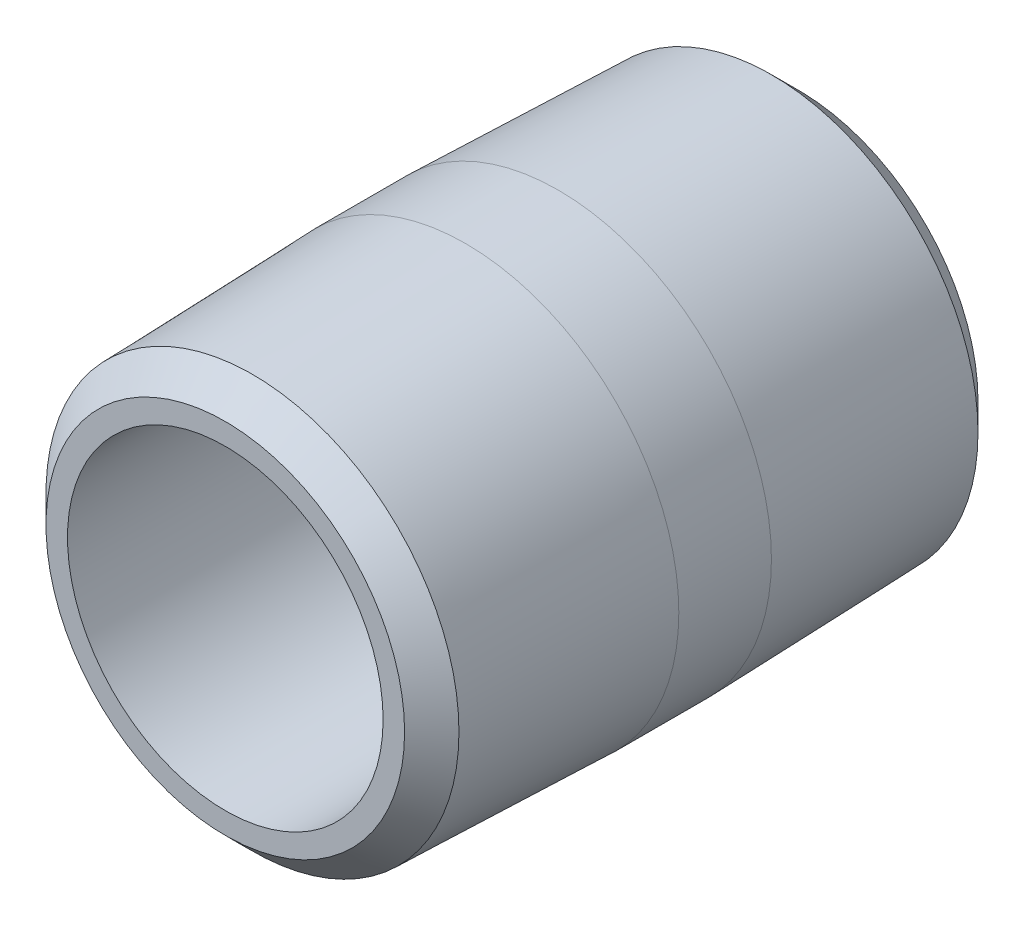
ISO-10303-21;
HEADER;
FILE_DESCRIPTION(('STEP AP214'),'2;1');
FILE_NAME('part.step','',(''),(''),'','','');
FILE_SCHEMA(('AUTOMOTIVE_DESIGN { 1 0 10303 214 1 1 1 1 }'));
ENDSEC;
DATA;
#1=APPLICATION_CONTEXT('core data for automotive mechanical design processes');
#2=APPLICATION_PROTOCOL_DEFINITION('international standard','automotive_design',2000,#1);
#3=PRODUCT_CONTEXT('',#1,'mechanical');
#4=PRODUCT('Part','Part','',(#3));
#5=PRODUCT_RELATED_PRODUCT_CATEGORY('part','',(#4));
#6=PRODUCT_DEFINITION_FORMATION('','',#4);
#7=PRODUCT_DEFINITION_CONTEXT('part definition',#1,'design');
#8=PRODUCT_DEFINITION('design','',#6,#7);
#9=PRODUCT_DEFINITION_SHAPE('','',#8);
#10=(LENGTH_UNIT() NAMED_UNIT(*) SI_UNIT(.MILLI.,.METRE.));
#11=(NAMED_UNIT(*) PLANE_ANGLE_UNIT() SI_UNIT($,.RADIAN.));
#12=(NAMED_UNIT(*) SI_UNIT($,.STERADIAN.) SOLID_ANGLE_UNIT());
#13=UNCERTAINTY_MEASURE_WITH_UNIT(LENGTH_MEASURE(1.E-05),#10,'distance_accuracy_value','');
#14=(GEOMETRIC_REPRESENTATION_CONTEXT(3) GLOBAL_UNCERTAINTY_ASSIGNED_CONTEXT((#13)) GLOBAL_UNIT_ASSIGNED_CONTEXT((#10,
#11,#12)) REPRESENTATION_CONTEXT('',''));
#15=CARTESIAN_POINT('',(0.,0.,0.));
#16=DIRECTION('',(0.,0.,1.));
#17=DIRECTION('',(1.,0.,0.));
#18=AXIS2_PLACEMENT_3D('',#15,#16,#17);
#19=CARTESIAN_POINT('',(0.,0.,14.351));
#20=DIRECTION('',(0.,0.,1.));
#21=DIRECTION('',(1.,0.,0.));
#22=AXIS2_PLACEMENT_3D('',#19,#20,#21);
#23=CYLINDRICAL_SURFACE('',#22,7.8994);
#24=CARTESIAN_POINT('',(0.,0.,-14.351));
#25=DIRECTION('',(0.,0.,1.));
#26=DIRECTION('',(1.,0.,0.));
#27=AXIS2_PLACEMENT_3D('',#24,#25,#26);
#28=CIRCLE('',#27,7.8994);
#29=CARTESIAN_POINT('',(7.8994,0.,-14.351));
#30=VERTEX_POINT('',#29);
#31=EDGE_CURVE('E10',#30,#30,#28,.T.);
#32=ORIENTED_EDGE('',*,*,#31,.F.);
#33=EDGE_LOOP('',(#32));
#34=FACE_BOUND('',#33,.T.);
#35=CARTESIAN_POINT('',(0.,0.,14.351));
#36=DIRECTION('',(0.,0.,1.));
#37=DIRECTION('',(1.,0.,0.));
#38=AXIS2_PLACEMENT_3D('',#35,#36,#37);
#39=CIRCLE('',#38,7.8994);
#40=CARTESIAN_POINT('',(7.8994,0.,14.351));
#41=VERTEX_POINT('',#40);
#42=EDGE_CURVE('E74',#41,#41,#39,.T.);
#43=ORIENTED_EDGE('',*,*,#42,.T.);
#44=EDGE_LOOP('',(#43));
#45=FACE_BOUND('',#44,.T.);
#46=ADVANCED_FACE('F39',(#34,#45),#23,.F.);
#47=CARTESIAN_POINT('',(0.,7.8994,-14.351));
#48=DIRECTION('',(0.,0.,1.));
#49=DIRECTION('',(1.,0.,0.));
#50=AXIS2_PLACEMENT_3D('',#47,#48,#49);
#51=PLANE('',#50);
#52=CARTESIAN_POINT('',(0.,0.,-14.351));
#53=DIRECTION('',(0.,0.,1.));
#54=DIRECTION('',(1.,0.,0.));
#55=AXIS2_PLACEMENT_3D('',#52,#53,#54);
#56=CIRCLE('',#55,8.97499532009766);
#57=CARTESIAN_POINT('',(8.97499532009766,0.,-14.351));
#58=VERTEX_POINT('',#57);
#59=EDGE_CURVE('E46',#58,#58,#56,.T.);
#60=ORIENTED_EDGE('',*,*,#59,.F.);
#61=EDGE_LOOP('',(#60));
#62=FACE_BOUND('',#61,.T.);
#63=ORIENTED_EDGE('',*,*,#31,.T.);
#64=EDGE_LOOP('',(#63));
#65=FACE_BOUND('',#64,.T.);
#66=ADVANCED_FACE('F112',(#62,#65),#51,.F.);
#67=CARTESIAN_POINT('',(0.,0.,-14.351));
#68=DIRECTION('',(0.,0.,1.));
#69=DIRECTION('',(1.,0.,0.));
#70=AXIS2_PLACEMENT_3D('',#67,#68,#69);
#71=CONICAL_SURFACE('',#70,8.97499532009766,0.785398163397448);
#72=CARTESIAN_POINT('',(0.,0.,-12.9902857142857));
#73=DIRECTION('',(0.,0.,1.));
#74=DIRECTION('',(1.,0.,0.));
#75=AXIS2_PLACEMENT_3D('',#72,#73,#74);
#76=CIRCLE('',#75,10.3357096058119);
#77=CARTESIAN_POINT('',(10.3357096058119,0.,-12.9902857142857));
#78=VERTEX_POINT('',#77);
#79=EDGE_CURVE('E51',#78,#78,#76,.T.);
#80=ORIENTED_EDGE('',*,*,#79,.F.);
#81=EDGE_LOOP('',(#80));
#82=FACE_BOUND('',#81,.T.);
#83=ORIENTED_EDGE('',*,*,#59,.T.);
#84=EDGE_LOOP('',(#83));
#85=FACE_BOUND('',#84,.T.);
#86=ADVANCED_FACE('F107',(#82,#85),#71,.T.);
#87=CARTESIAN_POINT('',(0.,0.,-12.9902857142857));
#88=DIRECTION('',(0.,0.,1.));
#89=DIRECTION('',(1.,0.,0.));
#90=AXIS2_PLACEMENT_3D('',#87,#88,#89);
#91=CONICAL_SURFACE('',#90,10.3357096058119,0.0311250383272254);
#92=CARTESIAN_POINT('',(0.,0.,-2.31774999999999));
#93=DIRECTION('',(0.,0.,1.));
#94=DIRECTION('',(1.,0.,0.));
#95=AXIS2_PLACEMENT_3D('',#92,#93,#94);
#96=CIRCLE('',#95,10.668);
#97=CARTESIAN_POINT('',(10.668,0.,-2.31774999999999));
#98=VERTEX_POINT('',#97);
#99=EDGE_CURVE('E56',#98,#98,#96,.T.);
#100=ORIENTED_EDGE('',*,*,#99,.F.);
#101=EDGE_LOOP('',(#100));
#102=FACE_BOUND('',#101,.T.);
#103=ORIENTED_EDGE('',*,*,#79,.T.);
#104=EDGE_LOOP('',(#103));
#105=FACE_BOUND('',#104,.T.);
#106=ADVANCED_FACE('F101',(#102,#105),#91,.T.);
#107=CARTESIAN_POINT('',(0.,0.,14.351));
#108=DIRECTION('',(0.,0.,1.));
#109=DIRECTION('',(1.,0.,0.));
#110=AXIS2_PLACEMENT_3D('',#107,#108,#109);
#111=CYLINDRICAL_SURFACE('',#110,10.668);
#112=CARTESIAN_POINT('',(0.,0.,2.31774999999999));
#113=DIRECTION('',(0.,0.,1.));
#114=DIRECTION('',(1.,0.,0.));
#115=AXIS2_PLACEMENT_3D('',#112,#113,#114);
#116=CIRCLE('',#115,10.668);
#117=CARTESIAN_POINT('',(10.668,0.,2.31774999999999));
#118=VERTEX_POINT('',#117);
#119=EDGE_CURVE('E62',#118,#118,#116,.T.);
#120=ORIENTED_EDGE('',*,*,#119,.F.);
#121=EDGE_LOOP('',(#120));
#122=FACE_BOUND('',#121,.T.);
#123=ORIENTED_EDGE('',*,*,#99,.T.);
#124=EDGE_LOOP('',(#123));
#125=FACE_BOUND('',#124,.T.);
#126=ADVANCED_FACE('F95',(#122,#125),#111,.T.);
#127=CARTESIAN_POINT('',(0.,0.,2.31774999999999));
#128=DIRECTION('',(0.,0.,-1.));
#129=DIRECTION('',(-1.,0.,0.));
#130=AXIS2_PLACEMENT_3D('',#127,#128,#129);
#131=CONICAL_SURFACE('',#130,10.668,0.0311250383272254);
#132=CARTESIAN_POINT('',(0.,0.,12.9902857142857));
#133=DIRECTION('',(0.,0.,1.));
#134=DIRECTION('',(1.,0.,0.));
#135=AXIS2_PLACEMENT_3D('',#132,#133,#134);
#136=CIRCLE('',#135,10.3357096058119);
#137=CARTESIAN_POINT('',(10.3357096058119,0.,12.9902857142857));
#138=VERTEX_POINT('',#137);
#139=EDGE_CURVE('E66',#138,#138,#136,.T.);
#140=ORIENTED_EDGE('',*,*,#139,.F.);
#141=EDGE_LOOP('',(#140));
#142=FACE_BOUND('',#141,.T.);
#143=ORIENTED_EDGE('',*,*,#119,.T.);
#144=EDGE_LOOP('',(#143));
#145=FACE_BOUND('',#144,.T.);
#146=ADVANCED_FACE('F89',(#142,#145),#131,.T.);
#147=CARTESIAN_POINT('',(0.,0.,12.9902857142857));
#148=DIRECTION('',(0.,0.,-1.));
#149=DIRECTION('',(-1.,0.,0.));
#150=AXIS2_PLACEMENT_3D('',#147,#148,#149);
#151=CONICAL_SURFACE('',#150,10.3357096058119,0.785398163397449);
#152=CARTESIAN_POINT('',(0.,0.,14.351));
#153=DIRECTION('',(0.,0.,1.));
#154=DIRECTION('',(1.,0.,0.));
#155=AXIS2_PLACEMENT_3D('',#152,#153,#154);
#156=CIRCLE('',#155,8.97499532009766);
#157=CARTESIAN_POINT('',(8.97499532009766,0.,14.351));
#158=VERTEX_POINT('',#157);
#159=EDGE_CURVE('E70',#158,#158,#156,.T.);
#160=ORIENTED_EDGE('',*,*,#159,.F.);
#161=EDGE_LOOP('',(#160));
#162=FACE_BOUND('',#161,.T.);
#163=ORIENTED_EDGE('',*,*,#139,.T.);
#164=EDGE_LOOP('',(#163));
#165=FACE_BOUND('',#164,.T.);
#166=ADVANCED_FACE('F83',(#162,#165),#151,.T.);
#167=CARTESIAN_POINT('',(0.,7.8994,14.351));
#168=DIRECTION('',(0.,0.,-1.));
#169=DIRECTION('',(-1.,0.,0.));
#170=AXIS2_PLACEMENT_3D('',#167,#168,#169);
#171=PLANE('',#170);
#172=ORIENTED_EDGE('',*,*,#42,.F.);
#173=EDGE_LOOP('',(#172));
#174=FACE_BOUND('',#173,.T.);
#175=ORIENTED_EDGE('',*,*,#159,.T.);
#176=EDGE_LOOP('',(#175));
#177=FACE_BOUND('',#176,.T.);
#178=ADVANCED_FACE('F80',(#174,#177),#171,.F.);
#179=CLOSED_SHELL('',(#46,#66,#86,#106,#126,#146,#166,#178));
#180=MANIFOLD_SOLID_BREP('B2',#179);
#181=ADVANCED_BREP_SHAPE_REPRESENTATION('',(#18,#180),#14);
#182=SHAPE_DEFINITION_REPRESENTATION(#9,#181);
ENDSEC;
END-ISO-10303-21;
